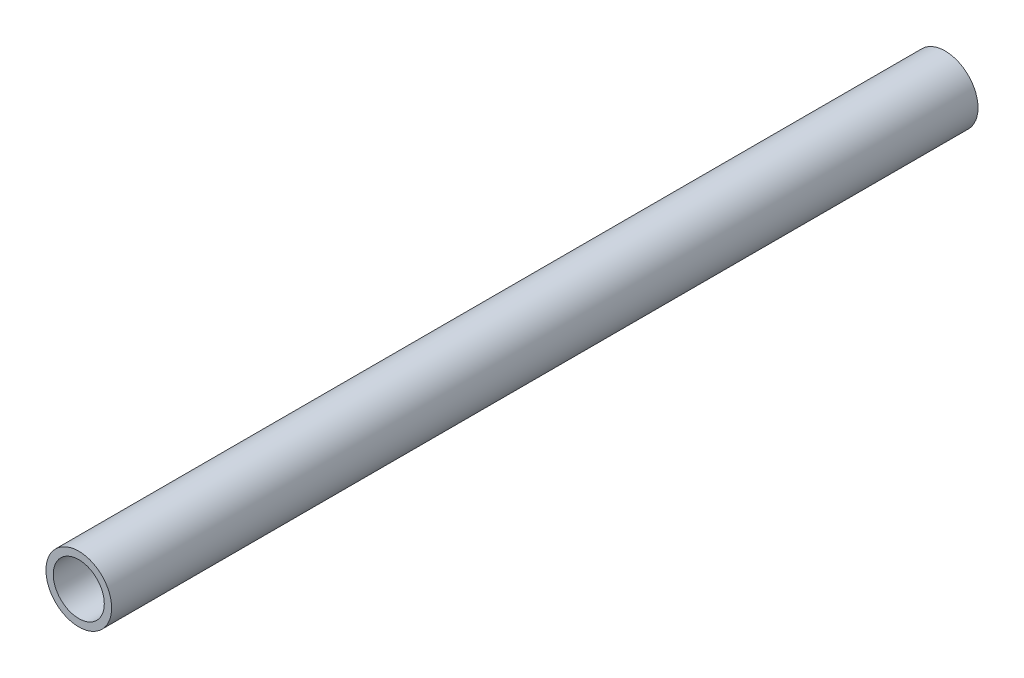
ISO-10303-21;
HEADER;
FILE_DESCRIPTION(('STEP AP214'),'2;1');
FILE_NAME('part.step','',(''),(''),'','','');
FILE_SCHEMA(('AUTOMOTIVE_DESIGN { 1 0 10303 214 1 1 1 1 }'));
ENDSEC;
DATA;
#1=APPLICATION_CONTEXT('core data for automotive mechanical design processes');
#2=APPLICATION_PROTOCOL_DEFINITION('international standard','automotive_design',2000,#1);
#3=PRODUCT_CONTEXT('',#1,'mechanical');
#4=PRODUCT('Part','Part','',(#3));
#5=PRODUCT_RELATED_PRODUCT_CATEGORY('part','',(#4));
#6=PRODUCT_DEFINITION_FORMATION('','',#4);
#7=PRODUCT_DEFINITION_CONTEXT('part definition',#1,'design');
#8=PRODUCT_DEFINITION('design','',#6,#7);
#9=PRODUCT_DEFINITION_SHAPE('','',#8);
#10=(LENGTH_UNIT() NAMED_UNIT(*) SI_UNIT(.MILLI.,.METRE.));
#11=(NAMED_UNIT(*) PLANE_ANGLE_UNIT() SI_UNIT($,.RADIAN.));
#12=(NAMED_UNIT(*) SI_UNIT($,.STERADIAN.) SOLID_ANGLE_UNIT());
#13=UNCERTAINTY_MEASURE_WITH_UNIT(LENGTH_MEASURE(1.E-05),#10,'distance_accuracy_value','');
#14=(GEOMETRIC_REPRESENTATION_CONTEXT(3) GLOBAL_UNCERTAINTY_ASSIGNED_CONTEXT((#13)) GLOBAL_UNIT_ASSIGNED_CONTEXT((#10,
#11,#12)) REPRESENTATION_CONTEXT('',''));
#15=CARTESIAN_POINT('',(0.,0.,0.));
#16=DIRECTION('',(0.,0.,1.));
#17=DIRECTION('',(1.,0.,0.));
#18=AXIS2_PLACEMENT_3D('',#15,#16,#17);
#19=CARTESIAN_POINT('',(0.,0.,237.54));
#20=DIRECTION('',(0.,0.,1.));
#21=DIRECTION('',(1.,0.,0.));
#22=AXIS2_PLACEMENT_3D('',#19,#20,#21);
#23=PLANE('',#22);
#24=CARTESIAN_POINT('',(0.,0.,237.54));
#25=DIRECTION('',(0.,0.,1.));
#26=DIRECTION('',(1.,0.,0.));
#27=AXIS2_PLACEMENT_3D('',#24,#25,#26);
#28=CIRCLE('',#27,9.);
#29=CARTESIAN_POINT('',(9.,0.,237.54));
#30=VERTEX_POINT('',#29);
#31=EDGE_CURVE('E10',#30,#30,#28,.T.);
#32=ORIENTED_EDGE('',*,*,#31,.T.);
#33=EDGE_LOOP('',(#32));
#34=FACE_BOUND('',#33,.T.);
#35=CARTESIAN_POINT('',(0.,0.,237.54));
#36=DIRECTION('',(0.,0.,1.));
#37=DIRECTION('',(1.,0.,0.));
#38=AXIS2_PLACEMENT_3D('',#35,#36,#37);
#39=CIRCLE('',#38,7.);
#40=CARTESIAN_POINT('',(7.,0.,237.54));
#41=VERTEX_POINT('',#40);
#42=EDGE_CURVE('E42',#41,#41,#39,.T.);
#43=ORIENTED_EDGE('',*,*,#42,.F.);
#44=EDGE_LOOP('',(#43));
#45=FACE_BOUND('',#44,.T.);
#46=ADVANCED_FACE('F31',(#34,#45),#23,.T.);
#47=CARTESIAN_POINT('',(0.,0.,0.));
#48=DIRECTION('',(0.,0.,1.));
#49=DIRECTION('',(1.,0.,0.));
#50=AXIS2_PLACEMENT_3D('',#47,#48,#49);
#51=PLANE('',#50);
#52=CARTESIAN_POINT('',(0.,0.,0.));
#53=DIRECTION('',(0.,0.,1.));
#54=DIRECTION('',(1.,0.,0.));
#55=AXIS2_PLACEMENT_3D('',#52,#53,#54);
#56=CIRCLE('',#55,9.);
#57=CARTESIAN_POINT('',(9.,0.,0.));
#58=VERTEX_POINT('',#57);
#59=EDGE_CURVE('E35',#58,#58,#56,.T.);
#60=ORIENTED_EDGE('',*,*,#59,.F.);
#61=EDGE_LOOP('',(#60));
#62=FACE_BOUND('',#61,.T.);
#63=CARTESIAN_POINT('',(0.,0.,0.));
#64=DIRECTION('',(0.,0.,1.));
#65=DIRECTION('',(1.,0.,0.));
#66=AXIS2_PLACEMENT_3D('',#63,#64,#65);
#67=CIRCLE('',#66,7.);
#68=CARTESIAN_POINT('',(7.,0.,0.));
#69=VERTEX_POINT('',#68);
#70=EDGE_CURVE('E44',#69,#69,#67,.T.);
#71=ORIENTED_EDGE('',*,*,#70,.T.);
#72=EDGE_LOOP('',(#71));
#73=FACE_BOUND('',#72,.T.);
#74=ADVANCED_FACE('F54',(#62,#73),#51,.F.);
#75=CARTESIAN_POINT('',(0.,0.,237.54));
#76=DIRECTION('',(0.,0.,-1.));
#77=DIRECTION('',(-1.,0.,0.));
#78=AXIS2_PLACEMENT_3D('',#75,#76,#77);
#79=CYLINDRICAL_SURFACE('',#78,9.);
#80=ORIENTED_EDGE('',*,*,#31,.F.);
#81=EDGE_LOOP('',(#80));
#82=FACE_BOUND('',#81,.T.);
#83=ORIENTED_EDGE('',*,*,#59,.T.);
#84=EDGE_LOOP('',(#83));
#85=FACE_BOUND('',#84,.T.);
#86=ADVANCED_FACE('F33',(#82,#85),#79,.T.);
#87=CARTESIAN_POINT('',(0.,0.,237.54));
#88=DIRECTION('',(0.,0.,-1.));
#89=DIRECTION('',(-1.,0.,0.));
#90=AXIS2_PLACEMENT_3D('',#87,#88,#89);
#91=CYLINDRICAL_SURFACE('',#90,7.);
#92=ORIENTED_EDGE('',*,*,#42,.T.);
#93=EDGE_LOOP('',(#92));
#94=FACE_BOUND('',#93,.T.);
#95=ORIENTED_EDGE('',*,*,#70,.F.);
#96=EDGE_LOOP('',(#95));
#97=FACE_BOUND('',#96,.T.);
#98=ADVANCED_FACE('F50',(#94,#97),#91,.F.);
#99=CLOSED_SHELL('',(#46,#74,#86,#98));
#100=MANIFOLD_SOLID_BREP('B2',#99);
#101=ADVANCED_BREP_SHAPE_REPRESENTATION('',(#18,#100),#14);
#102=SHAPE_DEFINITION_REPRESENTATION(#9,#101);
ENDSEC;
END-ISO-10303-21;
